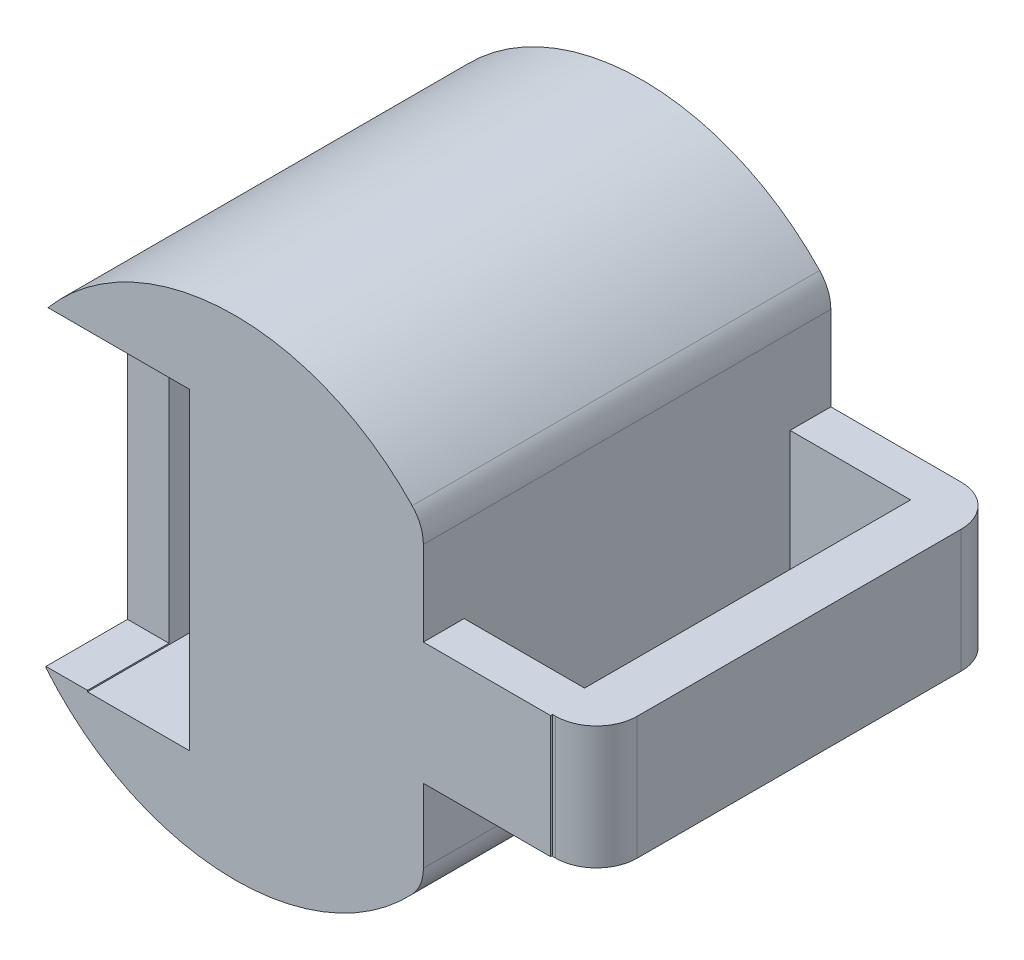
ISO-10303-21;
HEADER;
FILE_DESCRIPTION(('STEP AP214'),'2;1');
FILE_NAME('part.step','',(''),(''),'','','');
FILE_SCHEMA(('AUTOMOTIVE_DESIGN { 1 0 10303 214 1 1 1 1 }'));
ENDSEC;
DATA;
#1=APPLICATION_CONTEXT('core data for automotive mechanical design processes');
#2=APPLICATION_PROTOCOL_DEFINITION('international standard','automotive_design',2000,#1);
#3=PRODUCT_CONTEXT('',#1,'mechanical');
#4=PRODUCT('Part','Part','',(#3));
#5=PRODUCT_RELATED_PRODUCT_CATEGORY('part','',(#4));
#6=PRODUCT_DEFINITION_FORMATION('','',#4);
#7=PRODUCT_DEFINITION_CONTEXT('part definition',#1,'design');
#8=PRODUCT_DEFINITION('design','',#6,#7);
#9=PRODUCT_DEFINITION_SHAPE('','',#8);
#10=(LENGTH_UNIT() NAMED_UNIT(*) SI_UNIT(.MILLI.,.METRE.));
#11=(NAMED_UNIT(*) PLANE_ANGLE_UNIT() SI_UNIT($,.RADIAN.));
#12=(NAMED_UNIT(*) SI_UNIT($,.STERADIAN.) SOLID_ANGLE_UNIT());
#13=UNCERTAINTY_MEASURE_WITH_UNIT(LENGTH_MEASURE(1.E-05),#10,'distance_accuracy_value','');
#14=(GEOMETRIC_REPRESENTATION_CONTEXT(3) GLOBAL_UNCERTAINTY_ASSIGNED_CONTEXT((#13)) GLOBAL_UNIT_ASSIGNED_CONTEXT((#10,
#11,#12)) REPRESENTATION_CONTEXT('',''));
#15=CARTESIAN_POINT('',(0.,0.,0.));
#16=DIRECTION('',(0.,0.,1.));
#17=DIRECTION('',(1.,0.,0.));
#18=AXIS2_PLACEMENT_3D('',#15,#16,#17);
#19=CARTESIAN_POINT('',(-75.2117108329897,2.55000000000001,10.));
#20=DIRECTION('',(0.,0.,-1.));
#21=DIRECTION('',(-1.,0.,0.));
#22=AXIS2_PLACEMENT_3D('',#19,#20,#21);
#23=CYLINDRICAL_SURFACE('',#22,6.);
#24=CARTESIAN_POINT('',(-75.2117108329897,2.55000000000001,10.));
#25=DIRECTION('',(0.,0.,1.));
#26=DIRECTION('',(1.,0.,0.));
#27=AXIS2_PLACEMENT_3D('',#24,#25,#26);
#28=CIRCLE('',#27,6.);
#29=CARTESIAN_POINT('',(-79.8455933414732,-1.26144761180972,10.));
#30=VERTEX_POINT('',#29);
#31=CARTESIAN_POINT('',(-70.8585737048818,-1.57918843647134,10.));
#32=VERTEX_POINT('',#31);
#33=EDGE_CURVE('E394',#30,#32,#28,.T.);
#34=ORIENTED_EDGE('',*,*,#33,.F.);
#35=DIRECTION('',(0.,0.,-1.));
#36=VECTOR('',#35,1.);
#37=CARTESIAN_POINT('',(-79.8455933414732,-1.26144761180972,10.));
#38=LINE('',#37,#36);
#39=CARTESIAN_POINT('',(-79.8455933414732,-1.26144761180972,2.));
#40=VERTEX_POINT('',#39);
#41=EDGE_CURVE('E300',#30,#40,#38,.T.);
#42=ORIENTED_EDGE('',*,*,#41,.T.);
#43=DIRECTION('',(0.,0.,-1.));
#44=VECTOR('',#43,1.);
#45=CARTESIAN_POINT('',(-79.8455933414732,-1.26144761180972,10.));
#46=LINE('',#45,#44);
#47=CARTESIAN_POINT('',(-79.8455933414732,-1.26144761180972,0.));
#48=VERTEX_POINT('',#47);
#49=EDGE_CURVE('E265',#40,#48,#46,.T.);
#50=ORIENTED_EDGE('',*,*,#49,.T.);
#51=CARTESIAN_POINT('',(-75.2117108329897,2.55000000000001,0.));
#52=DIRECTION('',(0.,0.,1.));
#53=DIRECTION('',(1.,0.,0.));
#54=AXIS2_PLACEMENT_3D('',#51,#52,#53);
#55=CIRCLE('',#54,6.);
#56=CARTESIAN_POINT('',(-70.8585737048818,-1.57918843647134,0.));
#57=VERTEX_POINT('',#56);
#58=EDGE_CURVE('E386',#48,#57,#55,.T.);
#59=ORIENTED_EDGE('',*,*,#58,.T.);
#60=DIRECTION('',(0.,0.,-1.));
#61=VECTOR('',#60,1.);
#62=CARTESIAN_POINT('',(-70.8585737048818,-1.57918843647134,10.));
#63=LINE('',#62,#61);
#64=EDGE_CURVE('E41',#57,#32,#63,.F.);
#65=ORIENTED_EDGE('',*,*,#64,.T.);
#66=EDGE_LOOP('',(#34,#42,#50,#59,#65));
#67=FACE_BOUND('',#66,.T.);
#68=ADVANCED_FACE('F33',(#67),#23,.T.);
#69=CARTESIAN_POINT('',(-70.5840965595664,6.36905566029218,10.));
#70=DIRECTION('',(-1.,0.,0.));
#71=DIRECTION('',(0.,0.,1.));
#72=AXIS2_PLACEMENT_3D('',#69,#70,#71);
#73=PLANE('',#72);
#74=DIRECTION('',(0.,1.,0.));
#75=VECTOR('',#74,1.);
#76=CARTESIAN_POINT('',(-70.5840965595664,6.36905566029218,10.));
#77=LINE('',#76,#75);
#78=CARTESIAN_POINT('',(-70.5840965595664,-0.890990363726117,10.));
#79=VERTEX_POINT('',#78);
#80=CARTESIAN_POINT('',(-70.5840965595664,0.917510407191457,10.));
#81=VERTEX_POINT('',#80);
#82=EDGE_CURVE('E384',#79,#81,#77,.T.);
#83=ORIENTED_EDGE('',*,*,#82,.F.);
#84=DIRECTION('',(0.,0.,-1.));
#85=VECTOR('',#84,1.);
#86=CARTESIAN_POINT('',(-70.5840965595664,-0.890990363726119,10.));
#87=LINE('',#86,#85);
#88=CARTESIAN_POINT('',(-70.5840965595664,-0.890990363726117,0.));
#89=VERTEX_POINT('',#88);
#90=EDGE_CURVE('E430',#79,#89,#87,.T.);
#91=ORIENTED_EDGE('',*,*,#90,.T.);
#92=DIRECTION('',(0.,1.,0.));
#93=VECTOR('',#92,1.);
#94=CARTESIAN_POINT('',(-70.5840965595664,6.36905566029218,0.));
#95=LINE('',#94,#93);
#96=CARTESIAN_POINT('',(-70.5840965595664,0.917510407191457,0.));
#97=VERTEX_POINT('',#96);
#98=EDGE_CURVE('E388',#89,#97,#95,.T.);
#99=ORIENTED_EDGE('',*,*,#98,.T.);
#100=DIRECTION('',(0.,0.,-1.));
#101=VECTOR('',#100,1.);
#102=CARTESIAN_POINT('',(-70.5840965595664,0.917510407191457,0.));
#103=LINE('',#102,#101);
#104=CARTESIAN_POINT('',(-70.5840965595664,0.917510407191458,0.999999999999999));
#105=VERTEX_POINT('',#104);
#106=EDGE_CURVE('E345',#105,#97,#103,.T.);
#107=ORIENTED_EDGE('',*,*,#106,.F.);
#108=DIRECTION('',(0.,-1.,0.));
#109=VECTOR('',#108,1.);
#110=CARTESIAN_POINT('',(-70.5840965595664,3.91751040719146,1.));
#111=LINE('',#110,#109);
#112=CARTESIAN_POINT('',(-70.5840965595664,3.91751040719146,0.999999999999999));
#113=VERTEX_POINT('',#112);
#114=EDGE_CURVE('E342',#113,#105,#111,.T.);
#115=ORIENTED_EDGE('',*,*,#114,.F.);
#116=DIRECTION('',(0.,0.,1.));
#117=VECTOR('',#116,1.);
#118=CARTESIAN_POINT('',(-70.5840965595664,3.91751040719146,0.));
#119=LINE('',#118,#117);
#120=CARTESIAN_POINT('',(-70.5840965595664,3.91751040719146,0.));
#121=VERTEX_POINT('',#120);
#122=EDGE_CURVE('E339',#121,#113,#119,.T.);
#123=ORIENTED_EDGE('',*,*,#122,.F.);
#124=CARTESIAN_POINT('',(-70.5840965595664,5.99099036372614,0.));
#125=VERTEX_POINT('',#124);
#126=EDGE_CURVE('E377',#121,#125,#95,.T.);
#127=ORIENTED_EDGE('',*,*,#126,.T.);
#128=DIRECTION('',(0.,0.,-1.));
#129=VECTOR('',#128,1.);
#130=CARTESIAN_POINT('',(-70.5840965595664,5.99099036372614,10.));
#131=LINE('',#130,#129);
#132=CARTESIAN_POINT('',(-70.5840965595664,5.99099036372614,10.));
#133=VERTEX_POINT('',#132);
#134=EDGE_CURVE('E426',#125,#133,#131,.F.);
#135=ORIENTED_EDGE('',*,*,#134,.T.);
#136=CARTESIAN_POINT('',(-70.5840965595664,3.91751040719146,10.));
#137=VERTEX_POINT('',#136);
#138=EDGE_CURVE('E387',#137,#133,#77,.T.);
#139=ORIENTED_EDGE('',*,*,#138,.F.);
#140=DIRECTION('',(0.,0.,-1.));
#141=VECTOR('',#140,1.);
#142=CARTESIAN_POINT('',(-70.5840965595664,3.91751040719146,10.));
#143=LINE('',#142,#141);
#144=CARTESIAN_POINT('',(-70.5840965595664,3.91751040719146,9.));
#145=VERTEX_POINT('',#144);
#146=EDGE_CURVE('E357',#137,#145,#143,.T.);
#147=ORIENTED_EDGE('',*,*,#146,.T.);
#148=DIRECTION('',(0.,-1.,0.));
#149=VECTOR('',#148,1.);
#150=CARTESIAN_POINT('',(-70.5840965595664,3.91751040719146,9.));
#151=LINE('',#150,#149);
#152=CARTESIAN_POINT('',(-70.5840965595664,0.917510407191457,9.));
#153=VERTEX_POINT('',#152);
#154=EDGE_CURVE('E370',#145,#153,#151,.T.);
#155=ORIENTED_EDGE('',*,*,#154,.T.);
#156=DIRECTION('',(0.,0.,-1.));
#157=VECTOR('',#156,1.);
#158=CARTESIAN_POINT('',(-70.5840965595664,0.917510407191457,10.));
#159=LINE('',#158,#157);
#160=EDGE_CURVE('E362',#81,#153,#159,.T.);
#161=ORIENTED_EDGE('',*,*,#160,.F.);
#162=EDGE_LOOP('',(#83,#91,#99,#107,#115,#123,#127,#135,#139,#147,#155,#161));
#163=FACE_BOUND('',#162,.T.);
#164=ADVANCED_FACE('F449',(#163),#73,.F.);
#165=CARTESIAN_POINT('',(-75.2117108329897,2.55000000000001,0.));
#166=DIRECTION('',(0.,0.,1.));
#167=DIRECTION('',(1.,0.,0.));
#168=AXIS2_PLACEMENT_3D('',#165,#166,#167);
#169=PLANE('',#168);
#170=DIRECTION('',(1.,0.,0.));
#171=VECTOR('',#170,1.);
#172=CARTESIAN_POINT('',(-78.8275548369364,6.41979137797755,0.));
#173=LINE('',#172,#171);
#174=CARTESIAN_POINT('',(-79.7969823288698,6.41979137797755,0.));
#175=VERTEX_POINT('',#174);
#176=CARTESIAN_POINT('',(-76.3275548369364,6.41979137797755,0.));
#177=VERTEX_POINT('',#176);
#178=EDGE_CURVE('E271',#175,#177,#173,.T.);
#179=ORIENTED_EDGE('',*,*,#178,.F.);
#180=CARTESIAN_POINT('',(-70.8585737048818,6.67918843647136,0.));
#181=VERTEX_POINT('',#180);
#182=EDGE_CURVE('E395',#181,#175,#55,.T.);
#183=ORIENTED_EDGE('',*,*,#182,.F.);
#184=CARTESIAN_POINT('',(-71.5840965595664,5.99099036372614,0.));
#185=DIRECTION('',(0.,0.,1.));
#186=DIRECTION('',(1.,0.,0.));
#187=AXIS2_PLACEMENT_3D('',#184,#185,#186);
#188=CIRCLE('',#187,1.);
#189=EDGE_CURVE('E424',#181,#125,#188,.F.);
#190=ORIENTED_EDGE('',*,*,#189,.T.);
#191=ORIENTED_EDGE('',*,*,#126,.F.);
#192=DIRECTION('',(-1.,0.,0.));
#193=VECTOR('',#192,1.);
#194=CARTESIAN_POINT('',(-66.5840965595664,3.91751040719146,0.));
#195=LINE('',#194,#193);
#196=CARTESIAN_POINT('',(-67.3840965595664,3.91751040719146,0.));
#197=VERTEX_POINT('',#196);
#198=EDGE_CURVE('E355',#197,#121,#195,.T.);
#199=ORIENTED_EDGE('',*,*,#198,.F.);
#200=DIRECTION('',(0.,1.,0.));
#201=VECTOR('',#200,1.);
#202=CARTESIAN_POINT('',(-67.3840965595664,2.55000000000001,0.));
#203=LINE('',#202,#201);
#204=CARTESIAN_POINT('',(-67.3840965595664,0.900046076850458,0.));
#205=VERTEX_POINT('',#204);
#206=EDGE_CURVE('E407',#197,#205,#203,.F.);
#207=ORIENTED_EDGE('',*,*,#206,.T.);
#208=DIRECTION('',(1.,0.,0.));
#209=VECTOR('',#208,1.);
#210=CARTESIAN_POINT('',(-67.6277289461762,0.900046076850458,0.));
#211=LINE('',#210,#209);
#212=CARTESIAN_POINT('',(-67.6277289461762,0.900046076850458,0.));
#213=VERTEX_POINT('',#212);
#214=EDGE_CURVE('E321',#213,#205,#211,.T.);
#215=ORIENTED_EDGE('',*,*,#214,.F.);
#216=DIRECTION('',(0.,1.,0.));
#217=VECTOR('',#216,1.);
#218=CARTESIAN_POINT('',(-67.6277289461762,3.91751040719146,0.));
#219=LINE('',#218,#217);
#220=CARTESIAN_POINT('',(-67.6277289461762,0.917510407191457,0.));
#221=VERTEX_POINT('',#220);
#222=EDGE_CURVE('E309',#213,#221,#219,.T.);
#223=ORIENTED_EDGE('',*,*,#222,.T.);
#224=DIRECTION('',(-1.,0.,0.));
#225=VECTOR('',#224,1.);
#226=CARTESIAN_POINT('',(-66.5840965595664,0.917510407191457,0.));
#227=LINE('',#226,#225);
#228=EDGE_CURVE('E348',#221,#97,#227,.T.);
#229=ORIENTED_EDGE('',*,*,#228,.T.);
#230=ORIENTED_EDGE('',*,*,#98,.F.);
#231=CARTESIAN_POINT('',(-71.5840965595664,-0.890990363726119,0.));
#232=DIRECTION('',(0.,0.,1.));
#233=DIRECTION('',(1.,0.,0.));
#234=AXIS2_PLACEMENT_3D('',#231,#232,#233);
#235=CIRCLE('',#234,1.);
#236=EDGE_CURVE('E433',#89,#57,#235,.F.);
#237=ORIENTED_EDGE('',*,*,#236,.T.);
#238=ORIENTED_EDGE('',*,*,#58,.F.);
#239=DIRECTION('',(-1.,0.,0.));
#240=VECTOR('',#239,1.);
#241=CARTESIAN_POINT('',(-78.8275548369364,-1.26144761180972,0.));
#242=LINE('',#241,#240);
#243=CARTESIAN_POINT('',(-76.3275548369364,-1.26144761180972,0.));
#244=VERTEX_POINT('',#243);
#245=EDGE_CURVE('E276',#244,#48,#242,.T.);
#246=ORIENTED_EDGE('',*,*,#245,.F.);
#247=DIRECTION('',(0.,-1.,0.));
#248=VECTOR('',#247,1.);
#249=CARTESIAN_POINT('',(-76.3275548369364,-1.26144761180972,0.));
#250=LINE('',#249,#248);
#251=EDGE_CURVE('E286',#177,#244,#250,.T.);
#252=ORIENTED_EDGE('',*,*,#251,.F.);
#253=EDGE_LOOP('',(#179,#183,#190,#191,#199,#207,#215,#223,#229,#230,#237,#238,#246,#252));
#254=FACE_BOUND('',#253,.T.);
#255=ADVANCED_FACE('F478',(#254),#169,.F.);
#256=CARTESIAN_POINT('',(-75.2117108329897,2.55000000000001,10.));
#257=DIRECTION('',(0.,0.,1.));
#258=DIRECTION('',(1.,0.,0.));
#259=AXIS2_PLACEMENT_3D('',#256,#257,#258);
#260=PLANE('',#259);
#261=DIRECTION('',(1.,0.,0.));
#262=VECTOR('',#261,1.);
#263=CARTESIAN_POINT('',(-78.8275548369364,-1.229263709007,10.));
#264=LINE('',#263,#262);
#265=CARTESIAN_POINT('',(-79.8455933414732,-1.229263709007,10.));
#266=VERTEX_POINT('',#265);
#267=CARTESIAN_POINT('',(-78.8275548369364,-1.229263709007,10.));
#268=VERTEX_POINT('',#267);
#269=EDGE_CURVE('E776',#266,#268,#264,.T.);
#270=ORIENTED_EDGE('',*,*,#269,.F.);
#271=DIRECTION('',(0.,-1.,0.));
#272=VECTOR('',#271,1.);
#273=CARTESIAN_POINT('',(-79.8455933414732,6.36144761180974,10.));
#274=LINE('',#273,#272);
#275=EDGE_CURVE('E241',#266,#30,#274,.T.);
#276=ORIENTED_EDGE('',*,*,#275,.T.);
#277=ORIENTED_EDGE('',*,*,#33,.T.);
#278=CARTESIAN_POINT('',(-71.5840965595664,-0.890990363726119,10.));
#279=DIRECTION('',(0.,0.,1.));
#280=DIRECTION('',(1.,0.,0.));
#281=AXIS2_PLACEMENT_3D('',#278,#279,#280);
#282=CIRCLE('',#281,1.);
#283=EDGE_CURVE('E11',#32,#79,#282,.T.);
#284=ORIENTED_EDGE('',*,*,#283,.T.);
#285=ORIENTED_EDGE('',*,*,#82,.T.);
#286=DIRECTION('',(-1.,0.,0.));
#287=VECTOR('',#286,1.);
#288=CARTESIAN_POINT('',(-67.4620534867844,0.917510407191457,10.));
#289=LINE('',#288,#287);
#290=CARTESIAN_POINT('',(-67.4620534867844,0.917510407191457,10.));
#291=VERTEX_POINT('',#290);
#292=EDGE_CURVE('E378',#291,#81,#289,.T.);
#293=ORIENTED_EDGE('',*,*,#292,.F.);
#294=DIRECTION('',(0.,-1.,0.));
#295=VECTOR('',#294,1.);
#296=CARTESIAN_POINT('',(-67.4620534867844,3.91751040719146,10.));
#297=LINE('',#296,#295);
#298=CARTESIAN_POINT('',(-67.4620534867844,3.91751040719146,10.));
#299=VERTEX_POINT('',#298);
#300=EDGE_CURVE('E365',#299,#291,#297,.T.);
#301=ORIENTED_EDGE('',*,*,#300,.F.);
#302=DIRECTION('',(-1.,0.,0.));
#303=VECTOR('',#302,1.);
#304=CARTESIAN_POINT('',(-67.4620534867844,3.91751040719146,10.));
#305=LINE('',#304,#303);
#306=EDGE_CURVE('E375',#299,#137,#305,.T.);
#307=ORIENTED_EDGE('',*,*,#306,.T.);
#308=ORIENTED_EDGE('',*,*,#138,.T.);
#309=CARTESIAN_POINT('',(-71.5840965595664,5.99099036372614,10.));
#310=DIRECTION('',(0.,0.,1.));
#311=DIRECTION('',(1.,0.,0.));
#312=AXIS2_PLACEMENT_3D('',#309,#310,#311);
#313=CIRCLE('',#312,1.);
#314=CARTESIAN_POINT('',(-70.8585737048818,6.67918843647136,10.));
#315=VERTEX_POINT('',#314);
#316=EDGE_CURVE('E428',#133,#315,#313,.T.);
#317=ORIENTED_EDGE('',*,*,#316,.T.);
#318=CARTESIAN_POINT('',(-79.7969823288698,6.41979137797755,10.));
#319=VERTEX_POINT('',#318);
#320=EDGE_CURVE('E390',#315,#319,#28,.T.);
#321=ORIENTED_EDGE('',*,*,#320,.T.);
#322=DIRECTION('',(1.,0.,0.));
#323=VECTOR('',#322,1.);
#324=CARTESIAN_POINT('',(-78.8275548369364,6.41979137797755,10.));
#325=LINE('',#324,#323);
#326=CARTESIAN_POINT('',(-76.3275548369364,6.41979137797755,10.));
#327=VERTEX_POINT('',#326);
#328=EDGE_CURVE('E275',#319,#327,#325,.T.);
#329=ORIENTED_EDGE('',*,*,#328,.T.);
#330=DIRECTION('',(0.,-1.,0.));
#331=VECTOR('',#330,1.);
#332=CARTESIAN_POINT('',(-76.3275548369364,-1.26144761180972,10.));
#333=LINE('',#332,#331);
#334=CARTESIAN_POINT('',(-76.3275548369364,-1.26144761180972,10.));
#335=VERTEX_POINT('',#334);
#336=EDGE_CURVE('E56',#327,#335,#333,.T.);
#337=ORIENTED_EDGE('',*,*,#336,.T.);
#338=DIRECTION('',(-1.,0.,0.));
#339=VECTOR('',#338,1.);
#340=CARTESIAN_POINT('',(-78.8275548369364,-1.26144761180972,10.));
#341=LINE('',#340,#339);
#342=CARTESIAN_POINT('',(-78.8275548369364,-1.26144761180972,10.));
#343=VERTEX_POINT('',#342);
#344=EDGE_CURVE('E280',#335,#343,#341,.T.);
#345=ORIENTED_EDGE('',*,*,#344,.T.);
#346=DIRECTION('',(0.,1.,0.));
#347=VECTOR('',#346,1.);
#348=CARTESIAN_POINT('',(-78.8275548369364,-1.26144761180972,10.));
#349=LINE('',#348,#347);
#350=EDGE_CURVE('E272',#343,#268,#349,.T.);
#351=ORIENTED_EDGE('',*,*,#350,.T.);
#352=EDGE_LOOP('',(#270,#276,#277,#284,#285,#293,#301,#307,#308,#317,#321,#329,#337,#345,#351));
#353=FACE_BOUND('',#352,.T.);
#354=ADVANCED_FACE('F445',(#353),#260,.T.);
#355=CARTESIAN_POINT('',(-75.2117108329897,2.55000000000001,8.));
#356=DIRECTION('',(0.,0.,-1.));
#357=DIRECTION('',(-1.,0.,0.));
#358=AXIS2_PLACEMENT_3D('',#355,#356,#357);
#359=CIRCLE('',#358,6.);
#360=CARTESIAN_POINT('',(-79.8455933414732,6.36144761180974,8.));
#361=VERTEX_POINT('',#360);
#362=CARTESIAN_POINT('',(-79.7969823288698,6.41979137797755,8.));
#363=VERTEX_POINT('',#362);
#364=EDGE_CURVE('E225',#361,#363,#359,.T.);
#365=ORIENTED_EDGE('',*,*,#364,.T.);
#366=DIRECTION('',(0.,0.,-1.));
#367=VECTOR('',#366,1.);
#368=CARTESIAN_POINT('',(-79.7969823288698,6.41979137797755,10.));
#369=LINE('',#368,#367);
#370=EDGE_CURVE('E247',#363,#319,#369,.F.);
#371=ORIENTED_EDGE('',*,*,#370,.T.);
#372=ORIENTED_EDGE('',*,*,#320,.F.);
#373=DIRECTION('',(0.,0.,-1.));
#374=VECTOR('',#373,1.);
#375=CARTESIAN_POINT('',(-70.8585737048818,6.67918843647136,10.));
#376=LINE('',#375,#374);
#377=EDGE_CURVE('E421',#315,#181,#376,.T.);
#378=ORIENTED_EDGE('',*,*,#377,.T.);
#379=ORIENTED_EDGE('',*,*,#182,.T.);
#380=DIRECTION('',(0.,0.,-1.));
#381=VECTOR('',#380,1.);
#382=CARTESIAN_POINT('',(-79.7969823288698,6.41979137797755,10.));
#383=LINE('',#382,#381);
#384=CARTESIAN_POINT('',(-79.7969823288698,6.41979137797755,2.));
#385=VERTEX_POINT('',#384);
#386=EDGE_CURVE('E268',#175,#385,#383,.F.);
#387=ORIENTED_EDGE('',*,*,#386,.T.);
#388=CARTESIAN_POINT('',(-75.2117108329897,2.55000000000001,2.));
#389=DIRECTION('',(0.,0.,1.));
#390=DIRECTION('',(1.,0.,0.));
#391=AXIS2_PLACEMENT_3D('',#388,#389,#390);
#392=CIRCLE('',#391,6.);
#393=CARTESIAN_POINT('',(-79.8455933414732,6.36144761180974,2.));
#394=VERTEX_POINT('',#393);
#395=EDGE_CURVE('E262',#385,#394,#392,.T.);
#396=ORIENTED_EDGE('',*,*,#395,.T.);
#397=DIRECTION('',(0.,0.,-1.));
#398=VECTOR('',#397,1.);
#399=CARTESIAN_POINT('',(-79.8455933414732,6.36144761180974,10.));
#400=LINE('',#399,#398);
#401=EDGE_CURVE('E299',#361,#394,#400,.T.);
#402=ORIENTED_EDGE('',*,*,#401,.F.);
#403=EDGE_LOOP('',(#365,#371,#372,#378,#379,#387,#396,#402));
#404=FACE_BOUND('',#403,.T.);
#405=ADVANCED_FACE('F476',(#404),#23,.T.);
#406=CARTESIAN_POINT('',(-67.4620534867844,3.91751040719146,10.));
#407=DIRECTION('',(0.,1.,0.));
#408=DIRECTION('',(0.,0.,1.));
#409=AXIS2_PLACEMENT_3D('',#406,#407,#408);
#410=PLANE('',#409);
#411=DIRECTION('',(1.,0.,0.));
#412=VECTOR('',#411,1.);
#413=CARTESIAN_POINT('',(-67.6277289461762,3.91751040719146,9.95229496669842));
#414=LINE('',#413,#412);
#415=CARTESIAN_POINT('',(-67.4620534867844,3.91751040719146,9.95229496669842));
#416=VERTEX_POINT('',#415);
#417=CARTESIAN_POINT('',(-67.3840965595664,3.91751040719146,9.95229496669842));
#418=VERTEX_POINT('',#417);
#419=EDGE_CURVE('E320',#416,#418,#414,.T.);
#420=ORIENTED_EDGE('',*,*,#419,.T.);
#421=CARTESIAN_POINT('',(-67.3840965595664,3.91751040719146,8.95229496669842));
#422=DIRECTION('',(0.,1.,0.));
#423=DIRECTION('',(0.,0.,1.));
#424=AXIS2_PLACEMENT_3D('',#421,#422,#423);
#425=CIRCLE('',#424,1.);
#426=CARTESIAN_POINT('',(-66.3840965595664,3.91751040719146,8.95229496669842));
#427=VERTEX_POINT('',#426);
#428=EDGE_CURVE('E419',#418,#427,#425,.T.);
#429=ORIENTED_EDGE('',*,*,#428,.T.);
#430=DIRECTION('',(0.,0.,1.));
#431=VECTOR('',#430,1.);
#432=CARTESIAN_POINT('',(-66.3840965595664,3.91751040719146,0.));
#433=LINE('',#432,#431);
#434=CARTESIAN_POINT('',(-66.3840965595664,3.91751040719146,1.));
#435=VERTEX_POINT('',#434);
#436=EDGE_CURVE('E303',#435,#427,#433,.T.);
#437=ORIENTED_EDGE('',*,*,#436,.F.);
#438=CARTESIAN_POINT('',(-67.3840965595664,3.91751040719146,1.));
#439=DIRECTION('',(0.,1.,0.));
#440=DIRECTION('',(0.,0.,1.));
#441=AXIS2_PLACEMENT_3D('',#438,#439,#440);
#442=CIRCLE('',#441,1.);
#443=EDGE_CURVE('E405',#435,#197,#442,.T.);
#444=ORIENTED_EDGE('',*,*,#443,.T.);
#445=ORIENTED_EDGE('',*,*,#198,.T.);
#446=ORIENTED_EDGE('',*,*,#122,.T.);
#447=DIRECTION('',(-1.,0.,0.));
#448=VECTOR('',#447,1.);
#449=CARTESIAN_POINT('',(-66.5840965595664,3.91751040719146,1.));
#450=LINE('',#449,#448);
#451=CARTESIAN_POINT('',(-67.6277289461762,3.91751040719146,1.));
#452=VERTEX_POINT('',#451);
#453=EDGE_CURVE('E353',#452,#113,#450,.T.);
#454=ORIENTED_EDGE('',*,*,#453,.F.);
#455=DIRECTION('',(0.,0.,1.));
#456=VECTOR('',#455,1.);
#457=CARTESIAN_POINT('',(-67.6277289461762,3.91751040719146,0.));
#458=LINE('',#457,#456);
#459=CARTESIAN_POINT('',(-67.6277289461762,3.91751040719146,9.));
#460=VERTEX_POINT('',#459);
#461=EDGE_CURVE('E312',#452,#460,#458,.T.);
#462=ORIENTED_EDGE('',*,*,#461,.T.);
#463=DIRECTION('',(-1.,0.,0.));
#464=VECTOR('',#463,1.);
#465=CARTESIAN_POINT('',(-67.4620534867844,3.91751040719146,9.));
#466=LINE('',#465,#464);
#467=EDGE_CURVE('E367',#460,#145,#466,.T.);
#468=ORIENTED_EDGE('',*,*,#467,.T.);
#469=ORIENTED_EDGE('',*,*,#146,.F.);
#470=ORIENTED_EDGE('',*,*,#306,.F.);
#471=DIRECTION('',(0.,0.,-1.));
#472=VECTOR('',#471,1.);
#473=CARTESIAN_POINT('',(-67.4620534867844,3.91751040719146,10.));
#474=LINE('',#473,#472);
#475=EDGE_CURVE('E358',#299,#416,#474,.T.);
#476=ORIENTED_EDGE('',*,*,#475,.T.);
#477=EDGE_LOOP('',(#420,#429,#437,#444,#445,#446,#454,#462,#468,#469,#470,#476));
#478=FACE_BOUND('',#477,.T.);
#479=ADVANCED_FACE('F463',(#478),#410,.T.);
#480=CARTESIAN_POINT('',(-67.4620534867844,0.917510407191457,10.));
#481=DIRECTION('',(0.,1.,0.));
#482=DIRECTION('',(0.,0.,1.));
#483=AXIS2_PLACEMENT_3D('',#480,#481,#482);
#484=PLANE('',#483);
#485=DIRECTION('',(0.,0.,1.));
#486=VECTOR('',#485,1.);
#487=CARTESIAN_POINT('',(-67.6277289461762,0.917510407191457,10.));
#488=LINE('',#487,#486);
#489=CARTESIAN_POINT('',(-67.6277289461762,0.917510407191457,9.));
#490=VERTEX_POINT('',#489);
#491=CARTESIAN_POINT('',(-67.6277289461762,0.917510407191457,9.95229496669842));
#492=VERTEX_POINT('',#491);
#493=EDGE_CURVE('E333',#490,#492,#488,.T.);
#494=ORIENTED_EDGE('',*,*,#493,.T.);
#495=DIRECTION('',(1.,0.,0.));
#496=VECTOR('',#495,1.);
#497=CARTESIAN_POINT('',(-67.4620534867844,0.917510407191457,9.95229496669842));
#498=LINE('',#497,#496);
#499=CARTESIAN_POINT('',(-67.4620534867844,0.917510407191457,9.95229496669842));
#500=VERTEX_POINT('',#499);
#501=EDGE_CURVE('E336',#492,#500,#498,.T.);
#502=ORIENTED_EDGE('',*,*,#501,.T.);
#503=DIRECTION('',(0.,0.,-1.));
#504=VECTOR('',#503,1.);
#505=CARTESIAN_POINT('',(-67.4620534867844,0.917510407191457,10.));
#506=LINE('',#505,#504);
#507=EDGE_CURVE('E361',#291,#500,#506,.T.);
#508=ORIENTED_EDGE('',*,*,#507,.F.);
#509=ORIENTED_EDGE('',*,*,#292,.T.);
#510=ORIENTED_EDGE('',*,*,#160,.T.);
#511=DIRECTION('',(-1.,0.,0.));
#512=VECTOR('',#511,1.);
#513=CARTESIAN_POINT('',(-67.4620534867844,0.917510407191457,9.));
#514=LINE('',#513,#512);
#515=EDGE_CURVE('E381',#490,#153,#514,.T.);
#516=ORIENTED_EDGE('',*,*,#515,.F.);
#517=EDGE_LOOP('',(#494,#502,#508,#509,#510,#516));
#518=FACE_BOUND('',#517,.T.);
#519=ADVANCED_FACE('F454',(#518),#484,.F.);
#520=CARTESIAN_POINT('',(-67.4620534867844,3.91751040719146,9.));
#521=DIRECTION('',(0.,0.,-1.));
#522=DIRECTION('',(-1.,0.,0.));
#523=AXIS2_PLACEMENT_3D('',#520,#521,#522);
#524=PLANE('',#523);
#525=DIRECTION('',(0.,1.,0.));
#526=VECTOR('',#525,1.);
#527=CARTESIAN_POINT('',(-67.6277289461762,3.91751040719146,9.));
#528=LINE('',#527,#526);
#529=EDGE_CURVE('E331',#490,#460,#528,.T.);
#530=ORIENTED_EDGE('',*,*,#529,.F.);
#531=ORIENTED_EDGE('',*,*,#515,.T.);
#532=ORIENTED_EDGE('',*,*,#154,.F.);
#533=ORIENTED_EDGE('',*,*,#467,.F.);
#534=EDGE_LOOP('',(#530,#531,#532,#533));
#535=FACE_BOUND('',#534,.T.);
#536=ADVANCED_FACE('F507',(#535),#524,.T.);
#537=CARTESIAN_POINT('',(-67.4620534867844,0.,0.));
#538=DIRECTION('',(-1.,0.,0.));
#539=DIRECTION('',(0.,0.,1.));
#540=AXIS2_PLACEMENT_3D('',#537,#538,#539);
#541=PLANE('',#540);
#542=ORIENTED_EDGE('',*,*,#507,.T.);
#543=DIRECTION('',(0.,1.,0.));
#544=VECTOR('',#543,1.);
#545=CARTESIAN_POINT('',(-67.4620534867844,0.,9.95229496669842));
#546=LINE('',#545,#544);
#547=EDGE_CURVE('E399',#500,#416,#546,.T.);
#548=ORIENTED_EDGE('',*,*,#547,.T.);
#549=ORIENTED_EDGE('',*,*,#475,.F.);
#550=ORIENTED_EDGE('',*,*,#300,.T.);
#551=EDGE_LOOP('',(#542,#548,#549,#550));
#552=FACE_BOUND('',#551,.T.);
#553=ADVANCED_FACE('F461',(#552),#541,.F.);
#554=CARTESIAN_POINT('',(-66.5840965595664,3.91751040719146,1.));
#555=DIRECTION('',(0.,0.,-1.));
#556=DIRECTION('',(0.,1.,0.));
#557=AXIS2_PLACEMENT_3D('',#554,#555,#556);
#558=PLANE('',#557);
#559=DIRECTION('',(-1.,0.,0.));
#560=VECTOR('',#559,1.);
#561=CARTESIAN_POINT('',(-66.5840965595664,0.917510407191457,1.));
#562=LINE('',#561,#560);
#563=CARTESIAN_POINT('',(-67.6277289461762,0.917510407191457,1.));
#564=VERTEX_POINT('',#563);
#565=EDGE_CURVE('E351',#564,#105,#562,.T.);
#566=ORIENTED_EDGE('',*,*,#565,.F.);
#567=DIRECTION('',(0.,1.,0.));
#568=VECTOR('',#567,1.);
#569=CARTESIAN_POINT('',(-67.6277289461762,3.91751040719146,1.));
#570=LINE('',#569,#568);
#571=EDGE_CURVE('E324',#564,#452,#570,.T.);
#572=ORIENTED_EDGE('',*,*,#571,.T.);
#573=ORIENTED_EDGE('',*,*,#453,.T.);
#574=ORIENTED_EDGE('',*,*,#114,.T.);
#575=EDGE_LOOP('',(#566,#572,#573,#574));
#576=FACE_BOUND('',#575,.T.);
#577=ADVANCED_FACE('F497',(#576),#558,.F.);
#578=CARTESIAN_POINT('',(-66.5840965595664,0.917510407191457,0.));
#579=DIRECTION('',(0.,1.,0.));
#580=DIRECTION('',(0.,0.,1.));
#581=AXIS2_PLACEMENT_3D('',#578,#579,#580);
#582=PLANE('',#581);
#583=ORIENTED_EDGE('',*,*,#228,.F.);
#584=DIRECTION('',(0.,0.,1.));
#585=VECTOR('',#584,1.);
#586=CARTESIAN_POINT('',(-67.6277289461762,0.917510407191457,0.));
#587=LINE('',#586,#585);
#588=EDGE_CURVE('E393',#221,#564,#587,.T.);
#589=ORIENTED_EDGE('',*,*,#588,.T.);
#590=ORIENTED_EDGE('',*,*,#565,.T.);
#591=ORIENTED_EDGE('',*,*,#106,.T.);
#592=EDGE_LOOP('',(#583,#589,#590,#591));
#593=FACE_BOUND('',#592,.T.);
#594=ADVANCED_FACE('F650',(#593),#582,.F.);
#595=CARTESIAN_POINT('',(-67.6277289461762,3.91751040719146,9.95229496669842));
#596=DIRECTION('',(0.,0.,1.));
#597=DIRECTION('',(1.,0.,0.));
#598=AXIS2_PLACEMENT_3D('',#595,#596,#597);
#599=PLANE('',#598);
#600=DIRECTION('',(1.,0.,0.));
#601=VECTOR('',#600,1.);
#602=CARTESIAN_POINT('',(-67.6277289461762,0.900046076850458,9.95229496669842));
#603=LINE('',#602,#601);
#604=CARTESIAN_POINT('',(-67.6277289461762,0.900046076850458,9.95229496669842));
#605=VERTEX_POINT('',#604);
#606=CARTESIAN_POINT('',(-67.3840965595664,0.900046076850458,9.95229496669842));
#607=VERTEX_POINT('',#606);
#608=EDGE_CURVE('E325',#605,#607,#603,.T.);
#609=ORIENTED_EDGE('',*,*,#608,.T.);
#610=DIRECTION('',(0.,-1.,0.));
#611=VECTOR('',#610,1.);
#612=CARTESIAN_POINT('',(-67.3840965595664,3.91751040719146,9.95229496669842));
#613=LINE('',#612,#611);
#614=EDGE_CURVE('E417',#607,#418,#613,.F.);
#615=ORIENTED_EDGE('',*,*,#614,.T.);
#616=ORIENTED_EDGE('',*,*,#419,.F.);
#617=ORIENTED_EDGE('',*,*,#547,.F.);
#618=ORIENTED_EDGE('',*,*,#501,.F.);
#619=DIRECTION('',(0.,-1.,0.));
#620=VECTOR('',#619,1.);
#621=CARTESIAN_POINT('',(-67.6277289461762,3.91751040719146,9.95229496669842));
#622=LINE('',#621,#620);
#623=EDGE_CURVE('E315',#492,#605,#622,.T.);
#624=ORIENTED_EDGE('',*,*,#623,.T.);
#625=EDGE_LOOP('',(#609,#615,#616,#617,#618,#624));
#626=FACE_BOUND('',#625,.T.);
#627=ADVANCED_FACE('F658',(#626),#599,.T.);
#628=CARTESIAN_POINT('',(-67.6277289461762,0.,0.));
#629=DIRECTION('',(-1.,0.,0.));
#630=DIRECTION('',(0.,0.,1.));
#631=AXIS2_PLACEMENT_3D('',#628,#629,#630);
#632=PLANE('',#631);
#633=ORIENTED_EDGE('',*,*,#493,.F.);
#634=ORIENTED_EDGE('',*,*,#529,.T.);
#635=ORIENTED_EDGE('',*,*,#461,.F.);
#636=ORIENTED_EDGE('',*,*,#571,.F.);
#637=ORIENTED_EDGE('',*,*,#588,.F.);
#638=ORIENTED_EDGE('',*,*,#222,.F.);
#639=DIRECTION('',(0.,0.,-1.));
#640=VECTOR('',#639,1.);
#641=CARTESIAN_POINT('',(-67.6277289461762,0.900046076850458,0.));
#642=LINE('',#641,#640);
#643=EDGE_CURVE('E317',#605,#213,#642,.T.);
#644=ORIENTED_EDGE('',*,*,#643,.F.);
#645=ORIENTED_EDGE('',*,*,#623,.F.);
#646=EDGE_LOOP('',(#633,#634,#635,#636,#637,#638,#644,#645));
#647=FACE_BOUND('',#646,.T.);
#648=ADVANCED_FACE('F502',(#647),#632,.T.);
#649=CARTESIAN_POINT('',(-67.6277289461762,0.900046076850458,0.));
#650=DIRECTION('',(0.,-1.,0.));
#651=DIRECTION('',(0.,0.,-1.));
#652=AXIS2_PLACEMENT_3D('',#649,#650,#651);
#653=PLANE('',#652);
#654=DIRECTION('',(0.,0.,-1.));
#655=VECTOR('',#654,1.);
#656=CARTESIAN_POINT('',(-66.3840965595664,0.900046076850458,0.));
#657=LINE('',#656,#655);
#658=CARTESIAN_POINT('',(-66.3840965595664,0.900046076850458,8.95229496669842));
#659=VERTEX_POINT('',#658);
#660=CARTESIAN_POINT('',(-66.3840965595664,0.900046076850458,1.));
#661=VERTEX_POINT('',#660);
#662=EDGE_CURVE('E307',#659,#661,#657,.T.);
#663=ORIENTED_EDGE('',*,*,#662,.F.);
#664=CARTESIAN_POINT('',(-67.3840965595664,0.900046076850458,8.95229496669842));
#665=DIRECTION('',(0.,-1.,0.));
#666=DIRECTION('',(0.,0.,-1.));
#667=AXIS2_PLACEMENT_3D('',#664,#665,#666);
#668=CIRCLE('',#667,1.);
#669=EDGE_CURVE('E415',#659,#607,#668,.T.);
#670=ORIENTED_EDGE('',*,*,#669,.T.);
#671=ORIENTED_EDGE('',*,*,#608,.F.);
#672=ORIENTED_EDGE('',*,*,#643,.T.);
#673=ORIENTED_EDGE('',*,*,#214,.T.);
#674=CARTESIAN_POINT('',(-67.3840965595664,0.900046076850458,1.));
#675=DIRECTION('',(0.,-1.,0.));
#676=DIRECTION('',(0.,0.,-1.));
#677=AXIS2_PLACEMENT_3D('',#674,#675,#676);
#678=CIRCLE('',#677,1.);
#679=EDGE_CURVE('E409',#205,#661,#678,.T.);
#680=ORIENTED_EDGE('',*,*,#679,.T.);
#681=EDGE_LOOP('',(#663,#670,#671,#672,#673,#680));
#682=FACE_BOUND('',#681,.T.);
#683=ADVANCED_FACE('F686',(#682),#653,.T.);
#684=CARTESIAN_POINT('',(-66.3840965595664,0.,0.));
#685=DIRECTION('',(-1.,0.,0.));
#686=DIRECTION('',(0.,0.,1.));
#687=AXIS2_PLACEMENT_3D('',#684,#685,#686);
#688=PLANE('',#687);
#689=ORIENTED_EDGE('',*,*,#436,.T.);
#690=DIRECTION('',(0.,-1.,0.));
#691=VECTOR('',#690,1.);
#692=CARTESIAN_POINT('',(-66.3840965595664,0.900046076850458,8.95229496669842));
#693=LINE('',#692,#691);
#694=EDGE_CURVE('E412',#427,#659,#693,.T.);
#695=ORIENTED_EDGE('',*,*,#694,.T.);
#696=ORIENTED_EDGE('',*,*,#662,.T.);
#697=DIRECTION('',(0.,1.,0.));
#698=VECTOR('',#697,1.);
#699=CARTESIAN_POINT('',(-66.3840965595664,0.,1.));
#700=LINE('',#699,#698);
#701=EDGE_CURVE('E402',#661,#435,#700,.T.);
#702=ORIENTED_EDGE('',*,*,#701,.T.);
#703=EDGE_LOOP('',(#689,#695,#696,#702));
#704=FACE_BOUND('',#703,.T.);
#705=ADVANCED_FACE('F693',(#704),#688,.F.);
#706=CARTESIAN_POINT('',(-67.3840965595664,0.,1.));
#707=DIRECTION('',(0.,1.,0.));
#708=DIRECTION('',(0.,0.,1.));
#709=AXIS2_PLACEMENT_3D('',#706,#707,#708);
#710=CYLINDRICAL_SURFACE('',#709,1.);
#711=ORIENTED_EDGE('',*,*,#679,.F.);
#712=ORIENTED_EDGE('',*,*,#206,.F.);
#713=ORIENTED_EDGE('',*,*,#443,.F.);
#714=ORIENTED_EDGE('',*,*,#701,.F.);
#715=EDGE_LOOP('',(#711,#712,#713,#714));
#716=FACE_BOUND('',#715,.T.);
#717=ADVANCED_FACE('F702',(#716),#710,.T.);
#718=CARTESIAN_POINT('',(-67.3840965595664,0.,8.95229496669842));
#719=DIRECTION('',(0.,1.,0.));
#720=DIRECTION('',(0.,0.,1.));
#721=AXIS2_PLACEMENT_3D('',#718,#719,#720);
#722=CYLINDRICAL_SURFACE('',#721,1.);
#723=ORIENTED_EDGE('',*,*,#428,.F.);
#724=ORIENTED_EDGE('',*,*,#614,.F.);
#725=ORIENTED_EDGE('',*,*,#669,.F.);
#726=ORIENTED_EDGE('',*,*,#694,.F.);
#727=EDGE_LOOP('',(#723,#724,#725,#726));
#728=FACE_BOUND('',#727,.T.);
#729=ADVANCED_FACE('F710',(#728),#722,.T.);
#730=CARTESIAN_POINT('',(-71.5840965595664,5.99099036372614,10.));
#731=DIRECTION('',(0.,0.,-1.));
#732=DIRECTION('',(-1.,0.,0.));
#733=AXIS2_PLACEMENT_3D('',#730,#731,#732);
#734=CYLINDRICAL_SURFACE('',#733,1.);
#735=ORIENTED_EDGE('',*,*,#316,.F.);
#736=ORIENTED_EDGE('',*,*,#134,.F.);
#737=ORIENTED_EDGE('',*,*,#189,.F.);
#738=ORIENTED_EDGE('',*,*,#377,.F.);
#739=EDGE_LOOP('',(#735,#736,#737,#738));
#740=FACE_BOUND('',#739,.T.);
#741=ADVANCED_FACE('F473',(#740),#734,.T.);
#742=CARTESIAN_POINT('',(-71.5840965595664,-0.890990363726119,10.));
#743=DIRECTION('',(0.,0.,-1.));
#744=DIRECTION('',(-1.,0.,0.));
#745=AXIS2_PLACEMENT_3D('',#742,#743,#744);
#746=CYLINDRICAL_SURFACE('',#745,1.);
#747=ORIENTED_EDGE('',*,*,#283,.F.);
#748=ORIENTED_EDGE('',*,*,#64,.F.);
#749=ORIENTED_EDGE('',*,*,#236,.F.);
#750=ORIENTED_EDGE('',*,*,#90,.F.);
#751=EDGE_LOOP('',(#747,#748,#749,#750));
#752=FACE_BOUND('',#751,.T.);
#753=ADVANCED_FACE('F35',(#752),#746,.T.);
#754=CARTESIAN_POINT('',(-79.8455933414732,6.36144761180974,10.));
#755=DIRECTION('',(1.,0.,0.));
#756=DIRECTION('',(0.,0.,-1.));
#757=AXIS2_PLACEMENT_3D('',#754,#755,#756);
#758=PLANE('',#757);
#759=ORIENTED_EDGE('',*,*,#275,.F.);
#760=DIRECTION('',(0.,0.,1.));
#761=VECTOR('',#760,1.);
#762=CARTESIAN_POINT('',(-79.8455933414732,-1.229263709007,8.));
#763=LINE('',#762,#761);
#764=CARTESIAN_POINT('',(-79.8455933414732,-1.229263709007,8.));
#765=VERTEX_POINT('',#764);
#766=EDGE_CURVE('E233',#765,#266,#763,.T.);
#767=ORIENTED_EDGE('',*,*,#766,.F.);
#768=DIRECTION('',(0.,-1.,0.));
#769=VECTOR('',#768,1.);
#770=CARTESIAN_POINT('',(-79.8455933414732,6.41979137797755,8.));
#771=LINE('',#770,#769);
#772=EDGE_CURVE('E220',#361,#765,#771,.T.);
#773=ORIENTED_EDGE('',*,*,#772,.F.);
#774=ORIENTED_EDGE('',*,*,#401,.T.);
#775=DIRECTION('',(0.,-1.,0.));
#776=VECTOR('',#775,1.);
#777=CARTESIAN_POINT('',(-79.8455933414732,6.36144761180974,2.));
#778=LINE('',#777,#776);
#779=EDGE_CURVE('E259',#394,#40,#778,.T.);
#780=ORIENTED_EDGE('',*,*,#779,.T.);
#781=ORIENTED_EDGE('',*,*,#41,.F.);
#782=EDGE_LOOP('',(#759,#767,#773,#774,#780,#781));
#783=FACE_BOUND('',#782,.T.);
#784=ADVANCED_FACE('F239',(#783),#758,.F.);
#785=CARTESIAN_POINT('',(-78.8275548369364,-1.26144761180972,10.));
#786=DIRECTION('',(-1.,0.,0.));
#787=DIRECTION('',(0.,0.,1.));
#788=AXIS2_PLACEMENT_3D('',#785,#786,#787);
#789=PLANE('',#788);
#790=DIRECTION('',(0.,1.,0.));
#791=VECTOR('',#790,1.);
#792=CARTESIAN_POINT('',(-78.8275548369364,6.41979137797755,8.));
#793=LINE('',#792,#791);
#794=CARTESIAN_POINT('',(-78.8275548369364,-1.229263709007,8.));
#795=VERTEX_POINT('',#794);
#796=CARTESIAN_POINT('',(-78.8275548369364,6.41979137797755,8.));
#797=VERTEX_POINT('',#796);
#798=EDGE_CURVE('E48',#795,#797,#793,.T.);
#799=ORIENTED_EDGE('',*,*,#798,.F.);
#800=DIRECTION('',(0.,0.,1.));
#801=VECTOR('',#800,1.);
#802=CARTESIAN_POINT('',(-78.8275548369364,-1.229263709007,8.));
#803=LINE('',#802,#801);
#804=EDGE_CURVE('E236',#795,#268,#803,.T.);
#805=ORIENTED_EDGE('',*,*,#804,.T.);
#806=ORIENTED_EDGE('',*,*,#350,.F.);
#807=DIRECTION('',(0.,0.,-1.));
#808=VECTOR('',#807,1.);
#809=CARTESIAN_POINT('',(-78.8275548369364,-1.26144761180972,10.));
#810=LINE('',#809,#808);
#811=CARTESIAN_POINT('',(-78.8275548369364,-1.26144761180972,2.));
#812=VERTEX_POINT('',#811);
#813=EDGE_CURVE('E290',#343,#812,#810,.T.);
#814=ORIENTED_EDGE('',*,*,#813,.T.);
#815=DIRECTION('',(0.,-1.,0.));
#816=VECTOR('',#815,1.);
#817=CARTESIAN_POINT('',(-78.8275548369364,-1.26144761180972,2.));
#818=LINE('',#817,#816);
#819=CARTESIAN_POINT('',(-78.8275548369364,6.41979137797755,2.));
#820=VERTEX_POINT('',#819);
#821=EDGE_CURVE('E250',#820,#812,#818,.T.);
#822=ORIENTED_EDGE('',*,*,#821,.F.);
#823=DIRECTION('',(0.,0.,-1.));
#824=VECTOR('',#823,1.);
#825=CARTESIAN_POINT('',(-78.8275548369364,6.41979137797755,10.));
#826=LINE('',#825,#824);
#827=EDGE_CURVE('E283',#797,#820,#826,.T.);
#828=ORIENTED_EDGE('',*,*,#827,.F.);
#829=EDGE_LOOP('',(#799,#805,#806,#814,#822,#828));
#830=FACE_BOUND('',#829,.T.);
#831=ADVANCED_FACE('F583',(#830),#789,.F.);
#832=CARTESIAN_POINT('',(-78.8275548369364,-1.26144761180972,10.));
#833=DIRECTION('',(0.,-1.,0.));
#834=DIRECTION('',(0.,0.,-1.));
#835=AXIS2_PLACEMENT_3D('',#832,#833,#834);
#836=PLANE('',#835);
#837=ORIENTED_EDGE('',*,*,#245,.T.);
#838=ORIENTED_EDGE('',*,*,#49,.F.);
#839=DIRECTION('',(-1.,0.,0.));
#840=VECTOR('',#839,1.);
#841=CARTESIAN_POINT('',(-80.6179070928872,-1.26144761180972,2.));
#842=LINE('',#841,#840);
#843=EDGE_CURVE('E253',#812,#40,#842,.T.);
#844=ORIENTED_EDGE('',*,*,#843,.F.);
#845=ORIENTED_EDGE('',*,*,#813,.F.);
#846=ORIENTED_EDGE('',*,*,#344,.F.);
#847=DIRECTION('',(0.,0.,-1.));
#848=VECTOR('',#847,1.);
#849=CARTESIAN_POINT('',(-76.3275548369364,-1.26144761180972,10.));
#850=LINE('',#849,#848);
#851=EDGE_CURVE('E293',#335,#244,#850,.T.);
#852=ORIENTED_EDGE('',*,*,#851,.T.);
#853=EDGE_LOOP('',(#837,#838,#844,#845,#846,#852));
#854=FACE_BOUND('',#853,.T.);
#855=ADVANCED_FACE('F566',(#854),#836,.F.);
#856=CARTESIAN_POINT('',(-76.3275548369364,-1.26144761180972,10.));
#857=DIRECTION('',(1.,0.,0.));
#858=DIRECTION('',(0.,0.,-1.));
#859=AXIS2_PLACEMENT_3D('',#856,#857,#858);
#860=PLANE('',#859);
#861=ORIENTED_EDGE('',*,*,#251,.T.);
#862=ORIENTED_EDGE('',*,*,#851,.F.);
#863=ORIENTED_EDGE('',*,*,#336,.F.);
#864=DIRECTION('',(0.,0.,-1.));
#865=VECTOR('',#864,1.);
#866=CARTESIAN_POINT('',(-76.3275548369364,6.41979137797755,10.));
#867=LINE('',#866,#865);
#868=EDGE_CURVE('E295',#327,#177,#867,.T.);
#869=ORIENTED_EDGE('',*,*,#868,.T.);
#870=EDGE_LOOP('',(#861,#862,#863,#869));
#871=FACE_BOUND('',#870,.T.);
#872=ADVANCED_FACE('F562',(#871),#860,.F.);
#873=CARTESIAN_POINT('',(-78.8275548369364,6.41979137797755,10.));
#874=DIRECTION('',(0.,1.,0.));
#875=DIRECTION('',(0.,0.,1.));
#876=AXIS2_PLACEMENT_3D('',#873,#874,#875);
#877=PLANE('',#876);
#878=ORIENTED_EDGE('',*,*,#178,.T.);
#879=ORIENTED_EDGE('',*,*,#868,.F.);
#880=ORIENTED_EDGE('',*,*,#328,.F.);
#881=ORIENTED_EDGE('',*,*,#370,.F.);
#882=DIRECTION('',(-1.,0.,0.));
#883=VECTOR('',#882,1.);
#884=CARTESIAN_POINT('',(-78.8275548369364,6.41979137797755,8.));
#885=LINE('',#884,#883);
#886=EDGE_CURVE('E229',#797,#363,#885,.T.);
#887=ORIENTED_EDGE('',*,*,#886,.F.);
#888=ORIENTED_EDGE('',*,*,#827,.T.);
#889=DIRECTION('',(1.,0.,0.));
#890=VECTOR('',#889,1.);
#891=CARTESIAN_POINT('',(-78.8275548369364,6.41979137797755,2.));
#892=LINE('',#891,#890);
#893=EDGE_CURVE('E256',#385,#820,#892,.T.);
#894=ORIENTED_EDGE('',*,*,#893,.F.);
#895=ORIENTED_EDGE('',*,*,#386,.F.);
#896=EDGE_LOOP('',(#878,#879,#880,#881,#887,#888,#894,#895));
#897=FACE_BOUND('',#896,.T.);
#898=ADVANCED_FACE('F485',(#897),#877,.F.);
#899=CARTESIAN_POINT('',(0.,0.,2.));
#900=DIRECTION('',(0.,0.,1.));
#901=DIRECTION('',(1.,0.,0.));
#902=AXIS2_PLACEMENT_3D('',#899,#900,#901);
#903=PLANE('',#902);
#904=ORIENTED_EDGE('',*,*,#893,.T.);
#905=ORIENTED_EDGE('',*,*,#821,.T.);
#906=ORIENTED_EDGE('',*,*,#843,.T.);
#907=ORIENTED_EDGE('',*,*,#779,.F.);
#908=ORIENTED_EDGE('',*,*,#395,.F.);
#909=EDGE_LOOP('',(#904,#905,#906,#907,#908));
#910=FACE_BOUND('',#909,.T.);
#911=ADVANCED_FACE('F488',(#910),#903,.F.);
#912=CARTESIAN_POINT('',(0.,0.,8.));
#913=DIRECTION('',(0.,0.,-1.));
#914=DIRECTION('',(-1.,0.,0.));
#915=AXIS2_PLACEMENT_3D('',#912,#913,#914);
#916=PLANE('',#915);
#917=ORIENTED_EDGE('',*,*,#772,.T.);
#918=DIRECTION('',(1.,0.,0.));
#919=VECTOR('',#918,1.);
#920=CARTESIAN_POINT('',(-78.8275548369364,-1.229263709007,8.));
#921=LINE('',#920,#919);
#922=EDGE_CURVE('E223',#765,#795,#921,.T.);
#923=ORIENTED_EDGE('',*,*,#922,.T.);
#924=ORIENTED_EDGE('',*,*,#798,.T.);
#925=ORIENTED_EDGE('',*,*,#886,.T.);
#926=ORIENTED_EDGE('',*,*,#364,.F.);
#927=EDGE_LOOP('',(#917,#923,#924,#925,#926));
#928=FACE_BOUND('',#927,.T.);
#929=ADVANCED_FACE('F222',(#928),#916,.F.);
#930=CARTESIAN_POINT('',(-78.8275548369364,-1.229263709007,8.));
#931=DIRECTION('',(0.,-1.,0.));
#932=DIRECTION('',(0.,0.,-1.));
#933=AXIS2_PLACEMENT_3D('',#930,#931,#932);
#934=PLANE('',#933);
#935=ORIENTED_EDGE('',*,*,#269,.T.);
#936=ORIENTED_EDGE('',*,*,#804,.F.);
#937=ORIENTED_EDGE('',*,*,#922,.F.);
#938=ORIENTED_EDGE('',*,*,#766,.T.);
#939=EDGE_LOOP('',(#935,#936,#937,#938));
#940=FACE_BOUND('',#939,.T.);
#941=ADVANCED_FACE('F232',(#940),#934,.F.);
#942=CLOSED_SHELL('',(#68,#164,#255,#354,#405,#479,#519,#536,#553,#577,#594,#627,#648,#683,#705,
#717,#729,#741,#753,#784,#831,#855,#872,#898,#911,#929,#941));
#943=MANIFOLD_SOLID_BREP('B2',#942);
#944=ADVANCED_BREP_SHAPE_REPRESENTATION('',(#18,#943),#14);
#945=SHAPE_DEFINITION_REPRESENTATION(#9,#944);
ENDSEC;
END-ISO-10303-21;
